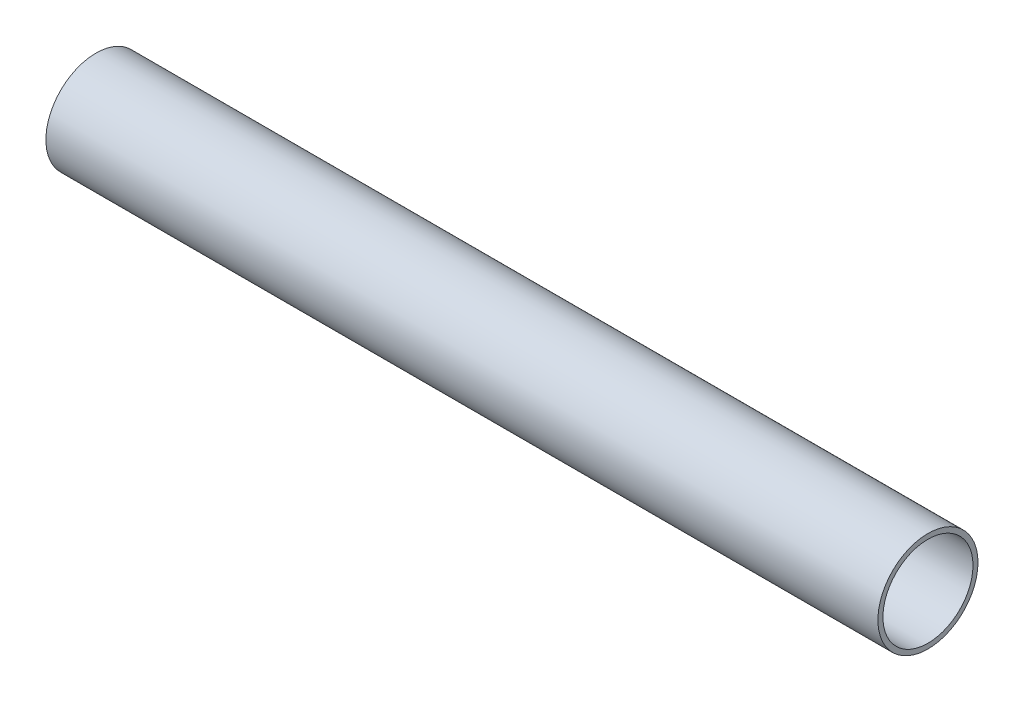
ISO-10303-21;
HEADER;
FILE_DESCRIPTION(('STEP AP214'),'2;1');
FILE_NAME('part.step','',(''),(''),'','','');
FILE_SCHEMA(('AUTOMOTIVE_DESIGN { 1 0 10303 214 1 1 1 1 }'));
ENDSEC;
DATA;
#1=APPLICATION_CONTEXT('core data for automotive mechanical design processes');
#2=APPLICATION_PROTOCOL_DEFINITION('international standard','automotive_design',2000,#1);
#3=PRODUCT_CONTEXT('',#1,'mechanical');
#4=PRODUCT('Part','Part','',(#3));
#5=PRODUCT_RELATED_PRODUCT_CATEGORY('part','',(#4));
#6=PRODUCT_DEFINITION_FORMATION('','',#4);
#7=PRODUCT_DEFINITION_CONTEXT('part definition',#1,'design');
#8=PRODUCT_DEFINITION('design','',#6,#7);
#9=PRODUCT_DEFINITION_SHAPE('','',#8);
#10=(LENGTH_UNIT() NAMED_UNIT(*) SI_UNIT(.MILLI.,.METRE.));
#11=(NAMED_UNIT(*) PLANE_ANGLE_UNIT() SI_UNIT($,.RADIAN.));
#12=(NAMED_UNIT(*) SI_UNIT($,.STERADIAN.) SOLID_ANGLE_UNIT());
#13=UNCERTAINTY_MEASURE_WITH_UNIT(LENGTH_MEASURE(1.E-05),#10,'distance_accuracy_value','');
#14=(GEOMETRIC_REPRESENTATION_CONTEXT(3) GLOBAL_UNCERTAINTY_ASSIGNED_CONTEXT((#13)) GLOBAL_UNIT_ASSIGNED_CONTEXT((#10,
#11,#12)) REPRESENTATION_CONTEXT('',''));
#15=CARTESIAN_POINT('',(0.,0.,0.));
#16=DIRECTION('',(0.,0.,1.));
#17=DIRECTION('',(1.,0.,0.));
#18=AXIS2_PLACEMENT_3D('',#15,#16,#17);
#19=CARTESIAN_POINT('',(131.955749997,0.,0.));
#20=DIRECTION('',(1.,0.,0.));
#21=DIRECTION('',(0.,0.,-1.));
#22=AXIS2_PLACEMENT_3D('',#19,#20,#21);
#23=PLANE('',#22);
#24=CARTESIAN_POINT('',(131.955749997,0.,0.));
#25=DIRECTION('',(1.,0.,0.));
#26=DIRECTION('',(0.,0.,-1.));
#27=AXIS2_PLACEMENT_3D('',#24,#25,#26);
#28=CIRCLE('',#27,15.875);
#29=CARTESIAN_POINT('',(131.955749997,0.,-15.875));
#30=VERTEX_POINT('',#29);
#31=EDGE_CURVE('E11',#30,#30,#28,.T.);
#32=ORIENTED_EDGE('',*,*,#31,.T.);
#33=EDGE_LOOP('',(#32));
#34=FACE_BOUND('',#33,.T.);
#35=CARTESIAN_POINT('',(131.955749997,0.,0.));
#36=DIRECTION('',(1.,0.,0.));
#37=DIRECTION('',(0.,0.,-1.));
#38=AXIS2_PLACEMENT_3D('',#35,#36,#37);
#39=CIRCLE('',#38,14.2875);
#40=CARTESIAN_POINT('',(131.955749997,0.,-14.2875));
#41=VERTEX_POINT('',#40);
#42=EDGE_CURVE('E52',#41,#41,#39,.T.);
#43=ORIENTED_EDGE('',*,*,#42,.F.);
#44=EDGE_LOOP('',(#43));
#45=FACE_BOUND('',#44,.T.);
#46=ADVANCED_FACE('F41',(#34,#45),#23,.T.);
#47=CARTESIAN_POINT('',(-131.955749997,0.,0.));
#48=DIRECTION('',(1.,0.,0.));
#49=DIRECTION('',(0.,0.,-1.));
#50=AXIS2_PLACEMENT_3D('',#47,#48,#49);
#51=PLANE('',#50);
#52=CARTESIAN_POINT('',(-131.955749997,0.,0.));
#53=DIRECTION('',(1.,0.,0.));
#54=DIRECTION('',(0.,0.,-1.));
#55=AXIS2_PLACEMENT_3D('',#52,#53,#54);
#56=CIRCLE('',#55,15.875);
#57=CARTESIAN_POINT('',(-131.955749997,0.,-15.875));
#58=VERTEX_POINT('',#57);
#59=EDGE_CURVE('E45',#58,#58,#56,.T.);
#60=ORIENTED_EDGE('',*,*,#59,.F.);
#61=EDGE_LOOP('',(#60));
#62=FACE_BOUND('',#61,.T.);
#63=CARTESIAN_POINT('',(-131.955749997,0.,0.));
#64=DIRECTION('',(1.,0.,0.));
#65=DIRECTION('',(0.,0.,-1.));
#66=AXIS2_PLACEMENT_3D('',#63,#64,#65);
#67=CIRCLE('',#66,14.2875);
#68=CARTESIAN_POINT('',(-131.955749997,0.,-14.2875));
#69=VERTEX_POINT('',#68);
#70=EDGE_CURVE('E54',#69,#69,#67,.T.);
#71=ORIENTED_EDGE('',*,*,#70,.T.);
#72=EDGE_LOOP('',(#71));
#73=FACE_BOUND('',#72,.T.);
#74=ADVANCED_FACE('F64',(#62,#73),#51,.F.);
#75=CARTESIAN_POINT('',(131.955749997,0.,0.));
#76=DIRECTION('',(-1.,0.,0.));
#77=DIRECTION('',(0.,0.,1.));
#78=AXIS2_PLACEMENT_3D('',#75,#76,#77);
#79=CYLINDRICAL_SURFACE('',#78,15.875);
#80=ORIENTED_EDGE('',*,*,#31,.F.);
#81=EDGE_LOOP('',(#80));
#82=FACE_BOUND('',#81,.T.);
#83=ORIENTED_EDGE('',*,*,#59,.T.);
#84=EDGE_LOOP('',(#83));
#85=FACE_BOUND('',#84,.T.);
#86=ADVANCED_FACE('F43',(#82,#85),#79,.T.);
#87=CARTESIAN_POINT('',(131.955749997,0.,0.));
#88=DIRECTION('',(-1.,0.,0.));
#89=DIRECTION('',(0.,0.,1.));
#90=AXIS2_PLACEMENT_3D('',#87,#88,#89);
#91=CYLINDRICAL_SURFACE('',#90,14.2875);
#92=ORIENTED_EDGE('',*,*,#42,.T.);
#93=EDGE_LOOP('',(#92));
#94=FACE_BOUND('',#93,.T.);
#95=ORIENTED_EDGE('',*,*,#70,.F.);
#96=EDGE_LOOP('',(#95));
#97=FACE_BOUND('',#96,.T.);
#98=ADVANCED_FACE('F60',(#94,#97),#91,.F.);
#99=CLOSED_SHELL('',(#46,#74,#86,#98));
#100=MANIFOLD_SOLID_BREP('B2',#99);
#101=ADVANCED_BREP_SHAPE_REPRESENTATION('',(#18,#100),#14);
#102=SHAPE_DEFINITION_REPRESENTATION(#9,#101);
ENDSEC;
END-ISO-10303-21;
